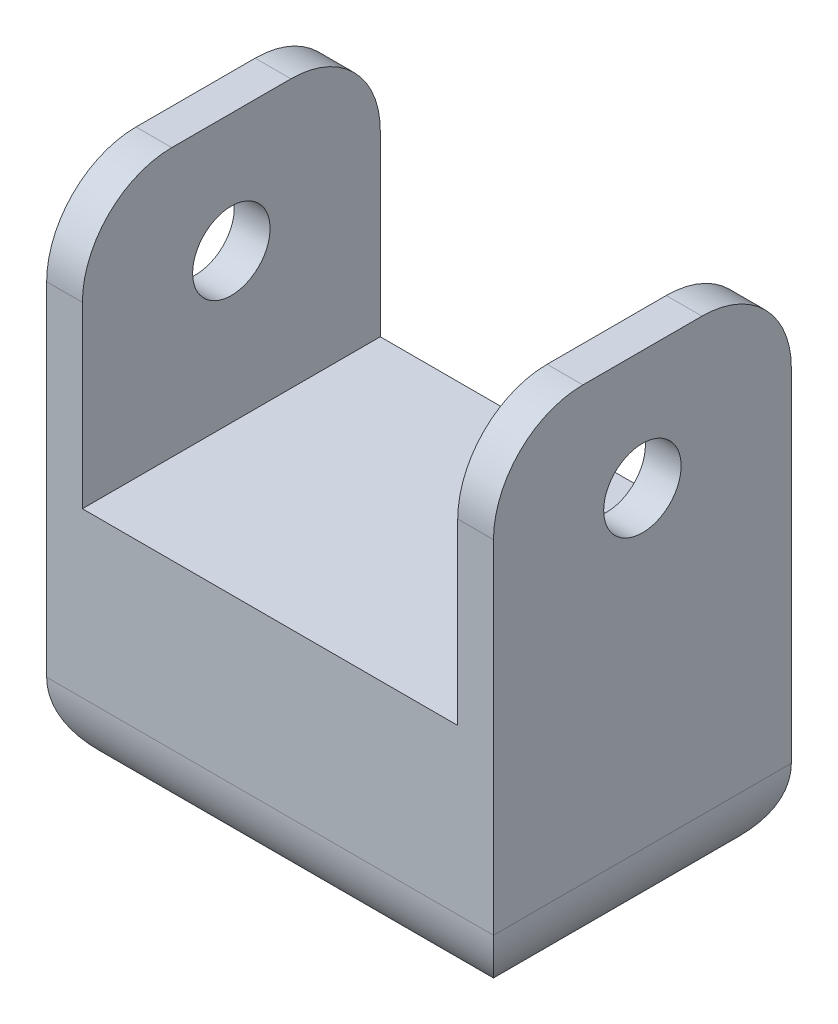
ISO-10303-21;
HEADER;
FILE_DESCRIPTION(('STEP AP214'),'2;1');
FILE_NAME('part.step','',(''),(''),'','','');
FILE_SCHEMA(('AUTOMOTIVE_DESIGN { 1 0 10303 214 1 1 1 1 }'));
ENDSEC;
DATA;
#1=APPLICATION_CONTEXT('core data for automotive mechanical design processes');
#2=APPLICATION_PROTOCOL_DEFINITION('international standard','automotive_design',2000,#1);
#3=PRODUCT_CONTEXT('',#1,'mechanical');
#4=PRODUCT('Part','Part','',(#3));
#5=PRODUCT_RELATED_PRODUCT_CATEGORY('part','',(#4));
#6=PRODUCT_DEFINITION_FORMATION('','',#4);
#7=PRODUCT_DEFINITION_CONTEXT('part definition',#1,'design');
#8=PRODUCT_DEFINITION('design','',#6,#7);
#9=PRODUCT_DEFINITION_SHAPE('','',#8);
#10=(LENGTH_UNIT() NAMED_UNIT(*) SI_UNIT(.MILLI.,.METRE.));
#11=(NAMED_UNIT(*) PLANE_ANGLE_UNIT() SI_UNIT($,.RADIAN.));
#12=(NAMED_UNIT(*) SI_UNIT($,.STERADIAN.) SOLID_ANGLE_UNIT());
#13=UNCERTAINTY_MEASURE_WITH_UNIT(LENGTH_MEASURE(1.E-05),#10,'distance_accuracy_value','');
#14=(GEOMETRIC_REPRESENTATION_CONTEXT(3) GLOBAL_UNCERTAINTY_ASSIGNED_CONTEXT((#13)) GLOBAL_UNIT_ASSIGNED_CONTEXT((#10,
#11,#12)) REPRESENTATION_CONTEXT('',''));
#15=CARTESIAN_POINT('',(0.,0.,0.));
#16=DIRECTION('',(0.,0.,1.));
#17=DIRECTION('',(1.,0.,0.));
#18=AXIS2_PLACEMENT_3D('',#15,#16,#17);
#19=CARTESIAN_POINT('',(0.,25.4,0.));
#20=DIRECTION('',(0.,1.,0.));
#21=DIRECTION('',(0.,0.,1.));
#22=AXIS2_PLACEMENT_3D('',#19,#20,#21);
#23=PLANE('',#22);
#24=DIRECTION('',(0.,0.,1.));
#25=VECTOR('',#24,1.);
#26=CARTESIAN_POINT('',(-19.05,25.4,-12.7));
#27=LINE('',#26,#25);
#28=CARTESIAN_POINT('',(-19.05,25.4,-5.08));
#29=VERTEX_POINT('',#28);
#30=CARTESIAN_POINT('',(-19.05,25.4,5.07999999999999));
#31=VERTEX_POINT('',#30);
#32=EDGE_CURVE('E187',#29,#31,#27,.T.);
#33=ORIENTED_EDGE('',*,*,#32,.T.);
#34=DIRECTION('',(1.,0.,0.));
#35=VECTOR('',#34,1.);
#36=CARTESIAN_POINT('',(-16.002,25.4,5.08));
#37=LINE('',#36,#35);
#38=CARTESIAN_POINT('',(-16.002,25.4,5.07999999999999));
#39=VERTEX_POINT('',#38);
#40=EDGE_CURVE('E227',#31,#39,#37,.T.);
#41=ORIENTED_EDGE('',*,*,#40,.T.);
#42=DIRECTION('',(0.,0.,1.));
#43=VECTOR('',#42,1.);
#44=CARTESIAN_POINT('',(-16.002,25.4,-12.7));
#45=LINE('',#44,#43);
#46=CARTESIAN_POINT('',(-16.002,25.4,-5.08));
#47=VERTEX_POINT('',#46);
#48=EDGE_CURVE('E173',#47,#39,#45,.T.);
#49=ORIENTED_EDGE('',*,*,#48,.F.);
#50=DIRECTION('',(-1.,0.,0.));
#51=VECTOR('',#50,1.);
#52=CARTESIAN_POINT('',(-19.05,25.4,-5.08));
#53=LINE('',#52,#51);
#54=EDGE_CURVE('E224',#47,#29,#53,.T.);
#55=ORIENTED_EDGE('',*,*,#54,.T.);
#56=EDGE_LOOP('',(#33,#41,#49,#55));
#57=FACE_BOUND('',#56,.T.);
#58=ADVANCED_FACE('F37',(#57),#23,.T.);
#59=CARTESIAN_POINT('',(19.05,25.4,-12.7));
#60=DIRECTION('',(-1.,0.,0.));
#61=DIRECTION('',(0.,0.,1.));
#62=AXIS2_PLACEMENT_3D('',#59,#60,#61);
#63=PLANE('',#62);
#64=CARTESIAN_POINT('',(19.05,15.24,0.));
#65=DIRECTION('',(-1.,0.,0.));
#66=DIRECTION('',(0.,0.,1.));
#67=AXIS2_PLACEMENT_3D('',#64,#65,#66);
#68=CIRCLE('',#67,3.302);
#69=CARTESIAN_POINT('',(19.05,15.24,3.30199999999999));
#70=VERTEX_POINT('',#69);
#71=EDGE_CURVE('E202',#70,#70,#68,.T.);
#72=ORIENTED_EDGE('',*,*,#71,.T.);
#73=EDGE_LOOP('',(#72));
#74=FACE_BOUND('',#73,.T.);
#75=DIRECTION('',(0.,-1.,0.));
#76=VECTOR('',#75,1.);
#77=CARTESIAN_POINT('',(19.05,25.4,12.7));
#78=LINE('',#77,#76);
#79=CARTESIAN_POINT('',(19.05,17.78,12.7));
#80=VERTEX_POINT('',#79);
#81=CARTESIAN_POINT('',(19.05,-11.43,12.7));
#82=VERTEX_POINT('',#81);
#83=EDGE_CURVE('E190',#80,#82,#78,.T.);
#84=ORIENTED_EDGE('',*,*,#83,.T.);
#85=DIRECTION('',(0.,0.,1.));
#86=VECTOR('',#85,1.);
#87=CARTESIAN_POINT('',(19.05,-11.43,-12.7));
#88=LINE('',#87,#86);
#89=CARTESIAN_POINT('',(19.05,-11.43,-12.7));
#90=VERTEX_POINT('',#89);
#91=EDGE_CURVE('E61',#82,#90,#88,.F.);
#92=ORIENTED_EDGE('',*,*,#91,.T.);
#93=DIRECTION('',(0.,-1.,0.));
#94=VECTOR('',#93,1.);
#95=CARTESIAN_POINT('',(19.05,25.4,-12.7));
#96=LINE('',#95,#94);
#97=CARTESIAN_POINT('',(19.05,17.78,-12.7));
#98=VERTEX_POINT('',#97);
#99=EDGE_CURVE('E196',#98,#90,#96,.T.);
#100=ORIENTED_EDGE('',*,*,#99,.F.);
#101=CARTESIAN_POINT('',(19.05,17.78,-5.08));
#102=DIRECTION('',(-1.,0.,0.));
#103=DIRECTION('',(0.,0.,1.));
#104=AXIS2_PLACEMENT_3D('',#101,#102,#103);
#105=CIRCLE('',#104,7.62);
#106=CARTESIAN_POINT('',(19.05,25.4,-5.08));
#107=VERTEX_POINT('',#106);
#108=EDGE_CURVE('E208',#98,#107,#105,.F.);
#109=ORIENTED_EDGE('',*,*,#108,.T.);
#110=DIRECTION('',(0.,0.,-1.));
#111=VECTOR('',#110,1.);
#112=CARTESIAN_POINT('',(19.05,25.4,-12.7));
#113=LINE('',#112,#111);
#114=CARTESIAN_POINT('',(19.05,25.4,5.07999999999999));
#115=VERTEX_POINT('',#114);
#116=EDGE_CURVE('E180',#115,#107,#113,.T.);
#117=ORIENTED_EDGE('',*,*,#116,.F.);
#118=CARTESIAN_POINT('',(19.05,17.78,5.08));
#119=DIRECTION('',(-1.,0.,0.));
#120=DIRECTION('',(0.,0.,1.));
#121=AXIS2_PLACEMENT_3D('',#118,#119,#120);
#122=CIRCLE('',#121,7.62);
#123=EDGE_CURVE('E210',#115,#80,#122,.F.);
#124=ORIENTED_EDGE('',*,*,#123,.T.);
#125=EDGE_LOOP('',(#84,#92,#100,#109,#117,#124));
#126=FACE_BOUND('',#125,.T.);
#127=ADVANCED_FACE('F291',(#74,#126),#63,.F.);
#128=CARTESIAN_POINT('',(-19.05,25.4,-12.7));
#129=DIRECTION('',(0.,0.,1.));
#130=DIRECTION('',(1.,0.,0.));
#131=AXIS2_PLACEMENT_3D('',#128,#129,#130);
#132=PLANE('',#131);
#133=ORIENTED_EDGE('',*,*,#99,.T.);
#134=DIRECTION('',(1.,0.,0.));
#135=VECTOR('',#134,1.);
#136=CARTESIAN_POINT('',(-19.05,-11.43,-12.7));
#137=LINE('',#136,#135);
#138=CARTESIAN_POINT('',(-19.05,-11.43,-12.7));
#139=VERTEX_POINT('',#138);
#140=EDGE_CURVE('E46',#90,#139,#137,.F.);
#141=ORIENTED_EDGE('',*,*,#140,.T.);
#142=DIRECTION('',(0.,-1.,0.));
#143=VECTOR('',#142,1.);
#144=CARTESIAN_POINT('',(-19.05,25.4,-12.7));
#145=LINE('',#144,#143);
#146=CARTESIAN_POINT('',(-19.05,17.78,-12.7));
#147=VERTEX_POINT('',#146);
#148=EDGE_CURVE('E194',#147,#139,#145,.T.);
#149=ORIENTED_EDGE('',*,*,#148,.F.);
#150=DIRECTION('',(-1.,0.,0.));
#151=VECTOR('',#150,1.);
#152=CARTESIAN_POINT('',(-16.002,17.78,-12.7));
#153=LINE('',#152,#151);
#154=CARTESIAN_POINT('',(-16.002,17.78,-12.7));
#155=VERTEX_POINT('',#154);
#156=EDGE_CURVE('E220',#147,#155,#153,.F.);
#157=ORIENTED_EDGE('',*,*,#156,.T.);
#158=DIRECTION('',(0.,1.,0.));
#159=VECTOR('',#158,1.);
#160=CARTESIAN_POINT('',(-16.002,2.54,-12.7));
#161=LINE('',#160,#159);
#162=CARTESIAN_POINT('',(-16.002,2.54,-12.7));
#163=VERTEX_POINT('',#162);
#164=EDGE_CURVE('E178',#163,#155,#161,.T.);
#165=ORIENTED_EDGE('',*,*,#164,.F.);
#166=DIRECTION('',(-1.,0.,0.));
#167=VECTOR('',#166,1.);
#168=CARTESIAN_POINT('',(-16.002,2.54,-12.7));
#169=LINE('',#168,#167);
#170=CARTESIAN_POINT('',(16.002,2.54,-12.7));
#171=VERTEX_POINT('',#170);
#172=EDGE_CURVE('E152',#171,#163,#169,.T.);
#173=ORIENTED_EDGE('',*,*,#172,.F.);
#174=DIRECTION('',(0.,1.,0.));
#175=VECTOR('',#174,1.);
#176=CARTESIAN_POINT('',(16.002,2.54,-12.7));
#177=LINE('',#176,#175);
#178=CARTESIAN_POINT('',(16.002,17.78,-12.7));
#179=VERTEX_POINT('',#178);
#180=EDGE_CURVE('E181',#171,#179,#177,.T.);
#181=ORIENTED_EDGE('',*,*,#180,.T.);
#182=DIRECTION('',(-1.,0.,0.));
#183=VECTOR('',#182,1.);
#184=CARTESIAN_POINT('',(19.05,17.78,-12.7));
#185=LINE('',#184,#183);
#186=EDGE_CURVE('E222',#179,#98,#185,.F.);
#187=ORIENTED_EDGE('',*,*,#186,.T.);
#188=EDGE_LOOP('',(#133,#141,#149,#157,#165,#173,#181,#187));
#189=FACE_BOUND('',#188,.T.);
#190=ADVANCED_FACE('F298',(#189),#132,.F.);
#191=CARTESIAN_POINT('',(-19.05,25.4,-12.7));
#192=DIRECTION('',(1.,0.,0.));
#193=DIRECTION('',(0.,0.,-1.));
#194=AXIS2_PLACEMENT_3D('',#191,#192,#193);
#195=PLANE('',#194);
#196=CARTESIAN_POINT('',(-19.05,15.24,0.));
#197=DIRECTION('',(-1.,0.,0.));
#198=DIRECTION('',(0.,0.,1.));
#199=AXIS2_PLACEMENT_3D('',#196,#197,#198);
#200=CIRCLE('',#199,3.302);
#201=CARTESIAN_POINT('',(-19.05,15.24,3.302));
#202=VERTEX_POINT('',#201);
#203=EDGE_CURVE('E261',#202,#202,#200,.T.);
#204=ORIENTED_EDGE('',*,*,#203,.F.);
#205=EDGE_LOOP('',(#204));
#206=FACE_BOUND('',#205,.T.);
#207=ORIENTED_EDGE('',*,*,#148,.T.);
#208=DIRECTION('',(0.,0.,-1.));
#209=VECTOR('',#208,1.);
#210=CARTESIAN_POINT('',(-19.05,-11.43,12.7));
#211=LINE('',#210,#209);
#212=CARTESIAN_POINT('',(-19.05,-11.43,12.7));
#213=VERTEX_POINT('',#212);
#214=EDGE_CURVE('E11',#139,#213,#211,.F.);
#215=ORIENTED_EDGE('',*,*,#214,.T.);
#216=DIRECTION('',(0.,-1.,0.));
#217=VECTOR('',#216,1.);
#218=CARTESIAN_POINT('',(-19.05,25.4,12.7));
#219=LINE('',#218,#217);
#220=CARTESIAN_POINT('',(-19.05,17.78,12.7));
#221=VERTEX_POINT('',#220);
#222=EDGE_CURVE('E192',#221,#213,#219,.T.);
#223=ORIENTED_EDGE('',*,*,#222,.F.);
#224=CARTESIAN_POINT('',(-19.05,17.78,5.08));
#225=DIRECTION('',(1.,0.,0.));
#226=DIRECTION('',(0.,0.,-1.));
#227=AXIS2_PLACEMENT_3D('',#224,#225,#226);
#228=CIRCLE('',#227,7.62);
#229=EDGE_CURVE('E235',#221,#31,#228,.F.);
#230=ORIENTED_EDGE('',*,*,#229,.T.);
#231=ORIENTED_EDGE('',*,*,#32,.F.);
#232=CARTESIAN_POINT('',(-19.05,17.78,-5.08));
#233=DIRECTION('',(1.,0.,0.));
#234=DIRECTION('',(0.,0.,-1.));
#235=AXIS2_PLACEMENT_3D('',#232,#233,#234);
#236=CIRCLE('',#235,7.62);
#237=EDGE_CURVE('E233',#29,#147,#236,.F.);
#238=ORIENTED_EDGE('',*,*,#237,.T.);
#239=EDGE_LOOP('',(#207,#215,#223,#230,#231,#238));
#240=FACE_BOUND('',#239,.T.);
#241=ADVANCED_FACE('F310',(#206,#240),#195,.F.);
#242=CARTESIAN_POINT('',(-19.05,25.4,12.7));
#243=DIRECTION('',(0.,0.,-1.));
#244=DIRECTION('',(-1.,0.,0.));
#245=AXIS2_PLACEMENT_3D('',#242,#243,#244);
#246=PLANE('',#245);
#247=ORIENTED_EDGE('',*,*,#222,.T.);
#248=DIRECTION('',(-1.,0.,0.));
#249=VECTOR('',#248,1.);
#250=CARTESIAN_POINT('',(19.05,-11.43,12.7));
#251=LINE('',#250,#249);
#252=EDGE_CURVE('E246',#213,#82,#251,.F.);
#253=ORIENTED_EDGE('',*,*,#252,.T.);
#254=ORIENTED_EDGE('',*,*,#83,.F.);
#255=DIRECTION('',(1.,0.,0.));
#256=VECTOR('',#255,1.);
#257=CARTESIAN_POINT('',(16.002,17.78,12.7));
#258=LINE('',#257,#256);
#259=CARTESIAN_POINT('',(16.002,17.78,12.7));
#260=VERTEX_POINT('',#259);
#261=EDGE_CURVE('E214',#80,#260,#258,.F.);
#262=ORIENTED_EDGE('',*,*,#261,.T.);
#263=DIRECTION('',(0.,1.,0.));
#264=VECTOR('',#263,1.);
#265=CARTESIAN_POINT('',(16.002,2.54,12.7));
#266=LINE('',#265,#264);
#267=CARTESIAN_POINT('',(16.002,2.54,12.7));
#268=VERTEX_POINT('',#267);
#269=EDGE_CURVE('E151',#268,#260,#266,.T.);
#270=ORIENTED_EDGE('',*,*,#269,.F.);
#271=DIRECTION('',(1.,0.,0.));
#272=VECTOR('',#271,1.);
#273=CARTESIAN_POINT('',(-16.002,2.54,12.7));
#274=LINE('',#273,#272);
#275=CARTESIAN_POINT('',(-16.002,2.54,12.7));
#276=VERTEX_POINT('',#275);
#277=EDGE_CURVE('E158',#276,#268,#274,.T.);
#278=ORIENTED_EDGE('',*,*,#277,.F.);
#279=DIRECTION('',(0.,1.,0.));
#280=VECTOR('',#279,1.);
#281=CARTESIAN_POINT('',(-16.002,2.54,12.7));
#282=LINE('',#281,#280);
#283=CARTESIAN_POINT('',(-16.002,17.78,12.7));
#284=VERTEX_POINT('',#283);
#285=EDGE_CURVE('E140',#276,#284,#282,.T.);
#286=ORIENTED_EDGE('',*,*,#285,.T.);
#287=DIRECTION('',(1.,0.,0.));
#288=VECTOR('',#287,1.);
#289=CARTESIAN_POINT('',(-19.05,17.78,12.7));
#290=LINE('',#289,#288);
#291=EDGE_CURVE('E212',#284,#221,#290,.F.);
#292=ORIENTED_EDGE('',*,*,#291,.T.);
#293=EDGE_LOOP('',(#247,#253,#254,#262,#270,#278,#286,#292));
#294=FACE_BOUND('',#293,.T.);
#295=ADVANCED_FACE('F165',(#294),#246,.F.);
#296=DIRECTION('',(0.,0.,-1.));
#297=VECTOR('',#296,1.);
#298=CARTESIAN_POINT('',(16.002,25.4,-12.7));
#299=LINE('',#298,#297);
#300=CARTESIAN_POINT('',(16.002,25.4,5.07999999999999));
#301=VERTEX_POINT('',#300);
#302=CARTESIAN_POINT('',(16.002,25.4,-5.08));
#303=VERTEX_POINT('',#302);
#304=EDGE_CURVE('E162',#301,#303,#299,.T.);
#305=ORIENTED_EDGE('',*,*,#304,.F.);
#306=DIRECTION('',(1.,0.,0.));
#307=VECTOR('',#306,1.);
#308=CARTESIAN_POINT('',(19.05,25.4,5.08));
#309=LINE('',#308,#307);
#310=EDGE_CURVE('E205',#301,#115,#309,.T.);
#311=ORIENTED_EDGE('',*,*,#310,.T.);
#312=ORIENTED_EDGE('',*,*,#116,.T.);
#313=DIRECTION('',(-1.,0.,0.));
#314=VECTOR('',#313,1.);
#315=CARTESIAN_POINT('',(16.002,25.4,-5.08));
#316=LINE('',#315,#314);
#317=EDGE_CURVE('E198',#107,#303,#316,.T.);
#318=ORIENTED_EDGE('',*,*,#317,.T.);
#319=EDGE_LOOP('',(#305,#311,#312,#318));
#320=FACE_BOUND('',#319,.T.);
#321=ADVANCED_FACE('F294',(#320),#23,.T.);
#322=CARTESIAN_POINT('',(-16.002,2.54,-12.7));
#323=DIRECTION('',(-1.,0.,0.));
#324=DIRECTION('',(0.,0.,1.));
#325=AXIS2_PLACEMENT_3D('',#322,#323,#324);
#326=PLANE('',#325);
#327=CARTESIAN_POINT('',(-16.002,15.24,0.));
#328=DIRECTION('',(-1.,0.,0.));
#329=DIRECTION('',(0.,0.,1.));
#330=AXIS2_PLACEMENT_3D('',#327,#328,#329);
#331=CIRCLE('',#330,3.302);
#332=CARTESIAN_POINT('',(-16.002,15.24,3.302));
#333=VERTEX_POINT('',#332);
#334=EDGE_CURVE('E175',#333,#333,#331,.T.);
#335=ORIENTED_EDGE('',*,*,#334,.T.);
#336=EDGE_LOOP('',(#335));
#337=FACE_BOUND('',#336,.T.);
#338=ORIENTED_EDGE('',*,*,#48,.T.);
#339=CARTESIAN_POINT('',(-16.002,17.78,5.08));
#340=DIRECTION('',(-1.,0.,0.));
#341=DIRECTION('',(0.,0.,1.));
#342=AXIS2_PLACEMENT_3D('',#339,#340,#341);
#343=CIRCLE('',#342,7.62);
#344=EDGE_CURVE('E147',#39,#284,#343,.F.);
#345=ORIENTED_EDGE('',*,*,#344,.T.);
#346=ORIENTED_EDGE('',*,*,#285,.F.);
#347=DIRECTION('',(0.,0.,1.));
#348=VECTOR('',#347,1.);
#349=CARTESIAN_POINT('',(-16.002,2.54,-12.7));
#350=LINE('',#349,#348);
#351=EDGE_CURVE('E145',#163,#276,#350,.T.);
#352=ORIENTED_EDGE('',*,*,#351,.F.);
#353=ORIENTED_EDGE('',*,*,#164,.T.);
#354=CARTESIAN_POINT('',(-16.002,17.78,-5.08));
#355=DIRECTION('',(-1.,0.,0.));
#356=DIRECTION('',(0.,0.,1.));
#357=AXIS2_PLACEMENT_3D('',#354,#355,#356);
#358=CIRCLE('',#357,7.62);
#359=EDGE_CURVE('E230',#155,#47,#358,.F.);
#360=ORIENTED_EDGE('',*,*,#359,.T.);
#361=EDGE_LOOP('',(#338,#345,#346,#352,#353,#360));
#362=FACE_BOUND('',#361,.T.);
#363=ADVANCED_FACE('F143',(#337,#362),#326,.F.);
#364=CARTESIAN_POINT('',(16.002,2.54,-12.7));
#365=DIRECTION('',(1.,0.,0.));
#366=DIRECTION('',(0.,0.,-1.));
#367=AXIS2_PLACEMENT_3D('',#364,#365,#366);
#368=PLANE('',#367);
#369=CARTESIAN_POINT('',(16.002,15.24,0.));
#370=DIRECTION('',(1.,0.,0.));
#371=DIRECTION('',(0.,0.,-1.));
#372=AXIS2_PLACEMENT_3D('',#369,#370,#371);
#373=CIRCLE('',#372,3.302);
#374=CARTESIAN_POINT('',(16.002,15.24,-3.302));
#375=VERTEX_POINT('',#374);
#376=EDGE_CURVE('E199',#375,#375,#373,.T.);
#377=ORIENTED_EDGE('',*,*,#376,.T.);
#378=EDGE_LOOP('',(#377));
#379=FACE_BOUND('',#378,.T.);
#380=ORIENTED_EDGE('',*,*,#269,.T.);
#381=CARTESIAN_POINT('',(16.002,17.78,5.08));
#382=DIRECTION('',(1.,0.,0.));
#383=DIRECTION('',(0.,0.,-1.));
#384=AXIS2_PLACEMENT_3D('',#381,#382,#383);
#385=CIRCLE('',#384,7.62);
#386=EDGE_CURVE('E218',#260,#301,#385,.F.);
#387=ORIENTED_EDGE('',*,*,#386,.T.);
#388=ORIENTED_EDGE('',*,*,#304,.T.);
#389=CARTESIAN_POINT('',(16.002,17.78,-5.08));
#390=DIRECTION('',(1.,0.,0.));
#391=DIRECTION('',(0.,0.,-1.));
#392=AXIS2_PLACEMENT_3D('',#389,#390,#391);
#393=CIRCLE('',#392,7.62);
#394=EDGE_CURVE('E216',#303,#179,#393,.F.);
#395=ORIENTED_EDGE('',*,*,#394,.T.);
#396=ORIENTED_EDGE('',*,*,#180,.F.);
#397=DIRECTION('',(0.,0.,-1.));
#398=VECTOR('',#397,1.);
#399=CARTESIAN_POINT('',(16.002,2.54,-12.7));
#400=LINE('',#399,#398);
#401=EDGE_CURVE('E167',#268,#171,#400,.T.);
#402=ORIENTED_EDGE('',*,*,#401,.F.);
#403=EDGE_LOOP('',(#380,#387,#388,#395,#396,#402));
#404=FACE_BOUND('',#403,.T.);
#405=ADVANCED_FACE('F309',(#379,#404),#368,.F.);
#406=CARTESIAN_POINT('',(0.,2.54,0.));
#407=DIRECTION('',(0.,1.,0.));
#408=DIRECTION('',(0.,0.,1.));
#409=AXIS2_PLACEMENT_3D('',#406,#407,#408);
#410=PLANE('',#409);
#411=ORIENTED_EDGE('',*,*,#351,.T.);
#412=ORIENTED_EDGE('',*,*,#277,.T.);
#413=ORIENTED_EDGE('',*,*,#401,.T.);
#414=ORIENTED_EDGE('',*,*,#172,.T.);
#415=EDGE_LOOP('',(#411,#412,#413,#414));
#416=FACE_BOUND('',#415,.T.);
#417=ADVANCED_FACE('F156',(#416),#410,.T.);
#418=CARTESIAN_POINT('',(19.05,15.24,0.));
#419=DIRECTION('',(-1.,0.,0.));
#420=DIRECTION('',(0.,0.,1.));
#421=AXIS2_PLACEMENT_3D('',#418,#419,#420);
#422=CYLINDRICAL_SURFACE('',#421,3.302);
#423=ORIENTED_EDGE('',*,*,#71,.F.);
#424=EDGE_LOOP('',(#423));
#425=FACE_BOUND('',#424,.T.);
#426=ORIENTED_EDGE('',*,*,#376,.F.);
#427=EDGE_LOOP('',(#426));
#428=FACE_BOUND('',#427,.T.);
#429=ADVANCED_FACE('F278',(#425,#428),#422,.F.);
#430=ORIENTED_EDGE('',*,*,#203,.T.);
#431=EDGE_LOOP('',(#430));
#432=FACE_BOUND('',#431,.T.);
#433=ORIENTED_EDGE('',*,*,#334,.F.);
#434=EDGE_LOOP('',(#433));
#435=FACE_BOUND('',#434,.T.);
#436=ADVANCED_FACE('F275',(#432,#435),#422,.F.);
#437=CARTESIAN_POINT('',(0.,17.78,5.08));
#438=DIRECTION('',(-1.,0.,0.));
#439=DIRECTION('',(0.,0.,1.));
#440=AXIS2_PLACEMENT_3D('',#437,#438,#439);
#441=CYLINDRICAL_SURFACE('',#440,7.62);
#442=ORIENTED_EDGE('',*,*,#386,.F.);
#443=ORIENTED_EDGE('',*,*,#261,.F.);
#444=ORIENTED_EDGE('',*,*,#123,.F.);
#445=ORIENTED_EDGE('',*,*,#310,.F.);
#446=EDGE_LOOP('',(#442,#443,#444,#445));
#447=FACE_BOUND('',#446,.T.);
#448=ADVANCED_FACE('F277',(#447),#441,.T.);
#449=CARTESIAN_POINT('',(0.,17.78,-5.08));
#450=DIRECTION('',(1.,0.,0.));
#451=DIRECTION('',(0.,0.,-1.));
#452=AXIS2_PLACEMENT_3D('',#449,#450,#451);
#453=CYLINDRICAL_SURFACE('',#452,7.62);
#454=ORIENTED_EDGE('',*,*,#108,.F.);
#455=ORIENTED_EDGE('',*,*,#186,.F.);
#456=ORIENTED_EDGE('',*,*,#394,.F.);
#457=ORIENTED_EDGE('',*,*,#317,.F.);
#458=EDGE_LOOP('',(#454,#455,#456,#457));
#459=FACE_BOUND('',#458,.T.);
#460=ADVANCED_FACE('F284',(#459),#453,.T.);
#461=CARTESIAN_POINT('',(0.,17.78,5.08));
#462=DIRECTION('',(-1.,0.,0.));
#463=DIRECTION('',(0.,0.,1.));
#464=AXIS2_PLACEMENT_3D('',#461,#462,#463);
#465=CYLINDRICAL_SURFACE('',#464,7.62);
#466=ORIENTED_EDGE('',*,*,#229,.F.);
#467=ORIENTED_EDGE('',*,*,#291,.F.);
#468=ORIENTED_EDGE('',*,*,#344,.F.);
#469=ORIENTED_EDGE('',*,*,#40,.F.);
#470=EDGE_LOOP('',(#466,#467,#468,#469));
#471=FACE_BOUND('',#470,.T.);
#472=ADVANCED_FACE('F344',(#471),#465,.T.);
#473=CARTESIAN_POINT('',(0.,17.78,-5.08));
#474=DIRECTION('',(1.,0.,0.));
#475=DIRECTION('',(0.,0.,-1.));
#476=AXIS2_PLACEMENT_3D('',#473,#474,#475);
#477=CYLINDRICAL_SURFACE('',#476,7.62);
#478=ORIENTED_EDGE('',*,*,#359,.F.);
#479=ORIENTED_EDGE('',*,*,#156,.F.);
#480=ORIENTED_EDGE('',*,*,#237,.F.);
#481=ORIENTED_EDGE('',*,*,#54,.F.);
#482=EDGE_LOOP('',(#478,#479,#480,#481));
#483=FACE_BOUND('',#482,.T.);
#484=ADVANCED_FACE('F341',(#483),#477,.T.);
#485=CARTESIAN_POINT('',(0.,-19.05,0.));
#486=DIRECTION('',(0.,-1.,0.));
#487=DIRECTION('',(0.,0.,-1.));
#488=AXIS2_PLACEMENT_3D('',#485,#486,#487);
#489=PLANE('',#488);
#490=DIRECTION('',(0.,0.,1.));
#491=VECTOR('',#490,1.);
#492=CARTESIAN_POINT('',(11.43,-19.05,12.7));
#493=LINE('',#492,#491);
#494=CARTESIAN_POINT('',(11.43,-19.05,-5.08));
#495=VERTEX_POINT('',#494);
#496=CARTESIAN_POINT('',(11.43,-19.05,5.08));
#497=VERTEX_POINT('',#496);
#498=EDGE_CURVE('E241',#495,#497,#493,.T.);
#499=ORIENTED_EDGE('',*,*,#498,.T.);
#500=DIRECTION('',(-1.,0.,0.));
#501=VECTOR('',#500,1.);
#502=CARTESIAN_POINT('',(-19.05,-19.05,5.08));
#503=LINE('',#502,#501);
#504=CARTESIAN_POINT('',(-11.43,-19.05,5.08));
#505=VERTEX_POINT('',#504);
#506=EDGE_CURVE('E243',#497,#505,#503,.T.);
#507=ORIENTED_EDGE('',*,*,#506,.T.);
#508=DIRECTION('',(0.,0.,-1.));
#509=VECTOR('',#508,1.);
#510=CARTESIAN_POINT('',(-11.43,-19.05,-12.7));
#511=LINE('',#510,#509);
#512=CARTESIAN_POINT('',(-11.43,-19.05,-5.08));
#513=VERTEX_POINT('',#512);
#514=EDGE_CURVE('E237',#505,#513,#511,.T.);
#515=ORIENTED_EDGE('',*,*,#514,.T.);
#516=DIRECTION('',(1.,0.,0.));
#517=VECTOR('',#516,1.);
#518=CARTESIAN_POINT('',(19.05,-19.05,-5.08));
#519=LINE('',#518,#517);
#520=EDGE_CURVE('E239',#513,#495,#519,.T.);
#521=ORIENTED_EDGE('',*,*,#520,.T.);
#522=EDGE_LOOP('',(#499,#507,#515,#521));
#523=FACE_BOUND('',#522,.T.);
#524=ADVANCED_FACE('F329',(#523),#489,.T.);
#525=CARTESIAN_POINT('',(0.,-11.43,-5.08));
#526=DIRECTION('',(-1.,0.,0.));
#527=DIRECTION('',(0.,0.,1.));
#528=AXIS2_PLACEMENT_3D('',#525,#526,#527);
#529=CYLINDRICAL_SURFACE('',#528,7.62);
#530=CARTESIAN_POINT('',(-11.43,-11.43,-5.08));
#531=DIRECTION('',(-0.707106781186547,0.,0.707106781186548));
#532=DIRECTION('',(0.707106781186548,0.,0.707106781186547));
#533=AXIS2_PLACEMENT_3D('',#530,#531,#532);
#534=ELLIPSE('',#533,10.776307345283,7.62);
#535=EDGE_CURVE('E254',#139,#513,#534,.T.);
#536=ORIENTED_EDGE('',*,*,#535,.F.);
#537=ORIENTED_EDGE('',*,*,#140,.F.);
#538=CARTESIAN_POINT('',(11.43,-11.43,-5.08));
#539=DIRECTION('',(-0.707106781186548,0.,-0.707106781186547));
#540=DIRECTION('',(-0.707106781186547,0.,0.707106781186548));
#541=AXIS2_PLACEMENT_3D('',#538,#539,#540);
#542=ELLIPSE('',#541,10.776307345283,7.62);
#543=EDGE_CURVE('E41',#495,#90,#542,.F.);
#544=ORIENTED_EDGE('',*,*,#543,.F.);
#545=ORIENTED_EDGE('',*,*,#520,.F.);
#546=EDGE_LOOP('',(#536,#537,#544,#545));
#547=FACE_BOUND('',#546,.T.);
#548=ADVANCED_FACE('F39',(#547),#529,.T.);
#549=CARTESIAN_POINT('',(11.43,-11.43,0.));
#550=DIRECTION('',(0.,0.,-1.));
#551=DIRECTION('',(-1.,0.,0.));
#552=AXIS2_PLACEMENT_3D('',#549,#550,#551);
#553=CYLINDRICAL_SURFACE('',#552,7.62);
#554=ORIENTED_EDGE('',*,*,#543,.T.);
#555=ORIENTED_EDGE('',*,*,#91,.F.);
#556=CARTESIAN_POINT('',(11.43,-11.43,5.08));
#557=DIRECTION('',(0.707106781186547,0.,-0.707106781186548));
#558=DIRECTION('',(-0.707106781186548,0.,-0.707106781186547));
#559=AXIS2_PLACEMENT_3D('',#556,#557,#558);
#560=ELLIPSE('',#559,10.776307345283,7.62);
#561=EDGE_CURVE('E253',#497,#82,#560,.F.);
#562=ORIENTED_EDGE('',*,*,#561,.F.);
#563=ORIENTED_EDGE('',*,*,#498,.F.);
#564=EDGE_LOOP('',(#554,#555,#562,#563));
#565=FACE_BOUND('',#564,.T.);
#566=ADVANCED_FACE('F330',(#565),#553,.T.);
#567=CARTESIAN_POINT('',(-11.43,-11.43,0.));
#568=DIRECTION('',(0.,0.,1.));
#569=DIRECTION('',(1.,0.,0.));
#570=AXIS2_PLACEMENT_3D('',#567,#568,#569);
#571=CYLINDRICAL_SURFACE('',#570,7.62);
#572=ORIENTED_EDGE('',*,*,#535,.T.);
#573=ORIENTED_EDGE('',*,*,#514,.F.);
#574=CARTESIAN_POINT('',(-11.43,-11.43,5.08));
#575=DIRECTION('',(0.707106781186548,0.,0.707106781186547));
#576=DIRECTION('',(-0.707106781186547,0.,0.707106781186548));
#577=AXIS2_PLACEMENT_3D('',#574,#575,#576);
#578=ELLIPSE('',#577,10.776307345283,7.62);
#579=EDGE_CURVE('E251',#213,#505,#578,.T.);
#580=ORIENTED_EDGE('',*,*,#579,.F.);
#581=ORIENTED_EDGE('',*,*,#214,.F.);
#582=EDGE_LOOP('',(#572,#573,#580,#581));
#583=FACE_BOUND('',#582,.T.);
#584=ADVANCED_FACE('F326',(#583),#571,.T.);
#585=CARTESIAN_POINT('',(0.,-11.43,5.08));
#586=DIRECTION('',(1.,0.,0.));
#587=DIRECTION('',(0.,0.,-1.));
#588=AXIS2_PLACEMENT_3D('',#585,#586,#587);
#589=CYLINDRICAL_SURFACE('',#588,7.62);
#590=ORIENTED_EDGE('',*,*,#561,.T.);
#591=ORIENTED_EDGE('',*,*,#252,.F.);
#592=ORIENTED_EDGE('',*,*,#579,.T.);
#593=ORIENTED_EDGE('',*,*,#506,.F.);
#594=EDGE_LOOP('',(#590,#591,#592,#593));
#595=FACE_BOUND('',#594,.T.);
#596=ADVANCED_FACE('F323',(#595),#589,.T.);
#597=CLOSED_SHELL('',(#58,#127,#190,#241,#295,#321,#363,#405,#417,#429,#436,#448,#460,#472,#484,
#524,#548,#566,#584,#596));
#598=MANIFOLD_SOLID_BREP('B2',#597);
#599=ADVANCED_BREP_SHAPE_REPRESENTATION('',(#18,#598),#14);
#600=SHAPE_DEFINITION_REPRESENTATION(#9,#599);
ENDSEC;
END-ISO-10303-21;
